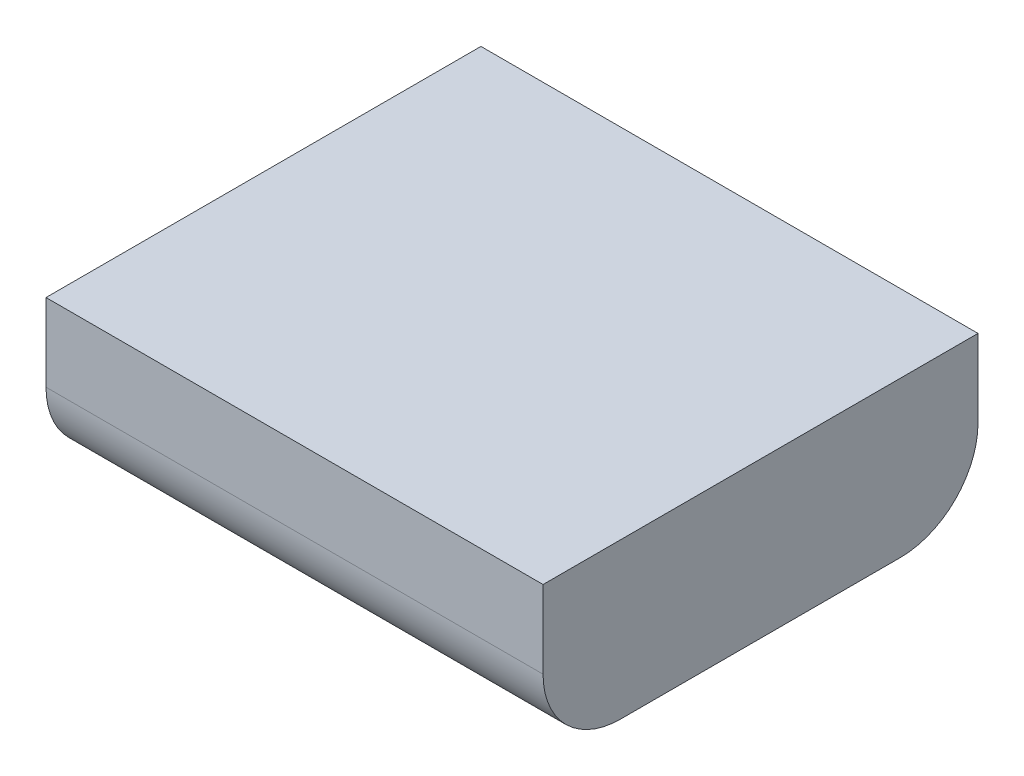
ISO-10303-21;
HEADER;
FILE_DESCRIPTION(('STEP AP214'),'2;1');
FILE_NAME('part.step','',(''),(''),'','','');
FILE_SCHEMA(('AUTOMOTIVE_DESIGN { 1 0 10303 214 1 1 1 1 }'));
ENDSEC;
DATA;
#1=APPLICATION_CONTEXT('core data for automotive mechanical design processes');
#2=APPLICATION_PROTOCOL_DEFINITION('international standard','automotive_design',2000,#1);
#3=PRODUCT_CONTEXT('',#1,'mechanical');
#4=PRODUCT('Part','Part','',(#3));
#5=PRODUCT_RELATED_PRODUCT_CATEGORY('part','',(#4));
#6=PRODUCT_DEFINITION_FORMATION('','',#4);
#7=PRODUCT_DEFINITION_CONTEXT('part definition',#1,'design');
#8=PRODUCT_DEFINITION('design','',#6,#7);
#9=PRODUCT_DEFINITION_SHAPE('','',#8);
#10=(LENGTH_UNIT() NAMED_UNIT(*) SI_UNIT(.MILLI.,.METRE.));
#11=(NAMED_UNIT(*) PLANE_ANGLE_UNIT() SI_UNIT($,.RADIAN.));
#12=(NAMED_UNIT(*) SI_UNIT($,.STERADIAN.) SOLID_ANGLE_UNIT());
#13=UNCERTAINTY_MEASURE_WITH_UNIT(LENGTH_MEASURE(1.E-05),#10,'distance_accuracy_value','');
#14=(GEOMETRIC_REPRESENTATION_CONTEXT(3) GLOBAL_UNCERTAINTY_ASSIGNED_CONTEXT((#13)) GLOBAL_UNIT_ASSIGNED_CONTEXT((#10,
#11,#12)) REPRESENTATION_CONTEXT('',''));
#15=CARTESIAN_POINT('',(0.,0.,0.));
#16=DIRECTION('',(0.,0.,1.));
#17=DIRECTION('',(1.,0.,0.));
#18=AXIS2_PLACEMENT_3D('',#15,#16,#17);
#19=CARTESIAN_POINT('',(16.,-5.,-14.));
#20=DIRECTION('',(0.,0.,1.));
#21=DIRECTION('',(1.,0.,0.));
#22=AXIS2_PLACEMENT_3D('',#19,#20,#21);
#23=PLANE('',#22);
#24=DIRECTION('',(0.,1.,0.));
#25=VECTOR('',#24,1.);
#26=CARTESIAN_POINT('',(16.,-5.,-14.));
#27=LINE('',#26,#25);
#28=CARTESIAN_POINT('',(16.,0.,-14.));
#29=VERTEX_POINT('',#28);
#30=CARTESIAN_POINT('',(16.,5.,-14.));
#31=VERTEX_POINT('',#30);
#32=EDGE_CURVE('E87',#29,#31,#27,.T.);
#33=ORIENTED_EDGE('',*,*,#32,.F.);
#34=DIRECTION('',(-1.,0.,0.));
#35=VECTOR('',#34,1.);
#36=CARTESIAN_POINT('',(16.,0.,-14.));
#37=LINE('',#36,#35);
#38=CARTESIAN_POINT('',(-16.,0.,-14.));
#39=VERTEX_POINT('',#38);
#40=EDGE_CURVE('E110',#29,#39,#37,.T.);
#41=ORIENTED_EDGE('',*,*,#40,.T.);
#42=DIRECTION('',(0.,1.,0.));
#43=VECTOR('',#42,1.);
#44=CARTESIAN_POINT('',(-16.,-5.,-14.));
#45=LINE('',#44,#43);
#46=CARTESIAN_POINT('',(-16.,5.,-14.));
#47=VERTEX_POINT('',#46);
#48=EDGE_CURVE('E108',#39,#47,#45,.T.);
#49=ORIENTED_EDGE('',*,*,#48,.T.);
#50=DIRECTION('',(-1.,0.,0.));
#51=VECTOR('',#50,1.);
#52=CARTESIAN_POINT('',(16.,5.,-14.));
#53=LINE('',#52,#51);
#54=EDGE_CURVE('E102',#31,#47,#53,.T.);
#55=ORIENTED_EDGE('',*,*,#54,.F.);
#56=EDGE_LOOP('',(#33,#41,#49,#55));
#57=FACE_BOUND('',#56,.T.);
#58=ADVANCED_FACE('F33',(#57),#23,.F.);
#59=CARTESIAN_POINT('',(16.,5.,14.));
#60=DIRECTION('',(0.,-1.,0.));
#61=DIRECTION('',(0.,0.,-1.));
#62=AXIS2_PLACEMENT_3D('',#59,#60,#61);
#63=PLANE('',#62);
#64=DIRECTION('',(0.,0.,1.));
#65=VECTOR('',#64,1.);
#66=CARTESIAN_POINT('',(-16.,5.,14.));
#67=LINE('',#66,#65);
#68=CARTESIAN_POINT('',(-16.,5.,14.));
#69=VERTEX_POINT('',#68);
#70=EDGE_CURVE('E137',#47,#69,#67,.T.);
#71=ORIENTED_EDGE('',*,*,#70,.T.);
#72=DIRECTION('',(-1.,0.,0.));
#73=VECTOR('',#72,1.);
#74=CARTESIAN_POINT('',(16.,5.,14.));
#75=LINE('',#74,#73);
#76=CARTESIAN_POINT('',(16.,5.,14.));
#77=VERTEX_POINT('',#76);
#78=EDGE_CURVE('E104',#77,#69,#75,.T.);
#79=ORIENTED_EDGE('',*,*,#78,.F.);
#80=DIRECTION('',(0.,0.,1.));
#81=VECTOR('',#80,1.);
#82=CARTESIAN_POINT('',(16.,5.,14.));
#83=LINE('',#82,#81);
#84=EDGE_CURVE('E90',#31,#77,#83,.T.);
#85=ORIENTED_EDGE('',*,*,#84,.F.);
#86=ORIENTED_EDGE('',*,*,#54,.T.);
#87=EDGE_LOOP('',(#71,#79,#85,#86));
#88=FACE_BOUND('',#87,.T.);
#89=ADVANCED_FACE('F101',(#88),#63,.F.);
#90=CARTESIAN_POINT('',(16.,-5.,14.));
#91=DIRECTION('',(0.,0.,-1.));
#92=DIRECTION('',(-1.,0.,0.));
#93=AXIS2_PLACEMENT_3D('',#90,#91,#92);
#94=PLANE('',#93);
#95=DIRECTION('',(0.,-1.,0.));
#96=VECTOR('',#95,1.);
#97=CARTESIAN_POINT('',(-16.,-5.,14.));
#98=LINE('',#97,#96);
#99=CARTESIAN_POINT('',(-16.,0.,14.));
#100=VERTEX_POINT('',#99);
#101=EDGE_CURVE('E135',#69,#100,#98,.T.);
#102=ORIENTED_EDGE('',*,*,#101,.T.);
#103=DIRECTION('',(-1.,0.,0.));
#104=VECTOR('',#103,1.);
#105=CARTESIAN_POINT('',(16.,0.,14.));
#106=LINE('',#105,#104);
#107=CARTESIAN_POINT('',(16.,0.,14.));
#108=VERTEX_POINT('',#107);
#109=EDGE_CURVE('E11',#100,#108,#106,.F.);
#110=ORIENTED_EDGE('',*,*,#109,.T.);
#111=DIRECTION('',(0.,-1.,0.));
#112=VECTOR('',#111,1.);
#113=CARTESIAN_POINT('',(16.,-5.,14.));
#114=LINE('',#113,#112);
#115=EDGE_CURVE('E105',#77,#108,#114,.T.);
#116=ORIENTED_EDGE('',*,*,#115,.F.);
#117=ORIENTED_EDGE('',*,*,#78,.T.);
#118=EDGE_LOOP('',(#102,#110,#116,#117));
#119=FACE_BOUND('',#118,.T.);
#120=ADVANCED_FACE('F136',(#119),#94,.F.);
#121=CARTESIAN_POINT('',(16.,-5.,14.));
#122=DIRECTION('',(0.,1.,0.));
#123=DIRECTION('',(0.,0.,1.));
#124=AXIS2_PLACEMENT_3D('',#121,#122,#123);
#125=PLANE('',#124);
#126=DIRECTION('',(0.,0.,-1.));
#127=VECTOR('',#126,1.);
#128=CARTESIAN_POINT('',(-16.,-5.,14.));
#129=LINE('',#128,#127);
#130=CARTESIAN_POINT('',(-16.,-5.,9.));
#131=VERTEX_POINT('',#130);
#132=CARTESIAN_POINT('',(-16.,-5.,-9.));
#133=VERTEX_POINT('',#132);
#134=EDGE_CURVE('E97',#131,#133,#129,.T.);
#135=ORIENTED_EDGE('',*,*,#134,.T.);
#136=DIRECTION('',(-1.,0.,0.));
#137=VECTOR('',#136,1.);
#138=CARTESIAN_POINT('',(16.,-5.,-9.));
#139=LINE('',#138,#137);
#140=CARTESIAN_POINT('',(16.,-5.,-9.));
#141=VERTEX_POINT('',#140);
#142=EDGE_CURVE('E54',#133,#141,#139,.F.);
#143=ORIENTED_EDGE('',*,*,#142,.T.);
#144=DIRECTION('',(0.,0.,-1.));
#145=VECTOR('',#144,1.);
#146=CARTESIAN_POINT('',(16.,-5.,14.));
#147=LINE('',#146,#145);
#148=CARTESIAN_POINT('',(16.,-5.,9.));
#149=VERTEX_POINT('',#148);
#150=EDGE_CURVE('E114',#149,#141,#147,.T.);
#151=ORIENTED_EDGE('',*,*,#150,.F.);
#152=DIRECTION('',(-1.,0.,0.));
#153=VECTOR('',#152,1.);
#154=CARTESIAN_POINT('',(16.,-5.,9.));
#155=LINE('',#154,#153);
#156=EDGE_CURVE('E121',#149,#131,#155,.T.);
#157=ORIENTED_EDGE('',*,*,#156,.T.);
#158=EDGE_LOOP('',(#135,#143,#151,#157));
#159=FACE_BOUND('',#158,.T.);
#160=ADVANCED_FACE('F129',(#159),#125,.F.);
#161=CARTESIAN_POINT('',(16.,0.,0.));
#162=DIRECTION('',(-1.,0.,0.));
#163=DIRECTION('',(0.,0.,1.));
#164=AXIS2_PLACEMENT_3D('',#161,#162,#163);
#165=PLANE('',#164);
#166=ORIENTED_EDGE('',*,*,#150,.T.);
#167=CARTESIAN_POINT('',(16.,0.,-9.));
#168=DIRECTION('',(-1.,0.,0.));
#169=DIRECTION('',(0.,0.,1.));
#170=AXIS2_PLACEMENT_3D('',#167,#168,#169);
#171=CIRCLE('',#170,5.);
#172=EDGE_CURVE('E41',#141,#29,#171,.F.);
#173=ORIENTED_EDGE('',*,*,#172,.T.);
#174=ORIENTED_EDGE('',*,*,#32,.T.);
#175=ORIENTED_EDGE('',*,*,#84,.T.);
#176=ORIENTED_EDGE('',*,*,#115,.T.);
#177=CARTESIAN_POINT('',(16.,0.,9.));
#178=DIRECTION('',(-1.,0.,0.));
#179=DIRECTION('',(0.,0.,1.));
#180=AXIS2_PLACEMENT_3D('',#177,#178,#179);
#181=CIRCLE('',#180,5.);
#182=EDGE_CURVE('E125',#108,#149,#181,.F.);
#183=ORIENTED_EDGE('',*,*,#182,.T.);
#184=EDGE_LOOP('',(#166,#173,#174,#175,#176,#183));
#185=FACE_BOUND('',#184,.T.);
#186=ADVANCED_FACE('F89',(#185),#165,.F.);
#187=CARTESIAN_POINT('',(-16.,0.,0.));
#188=DIRECTION('',(-1.,0.,0.));
#189=DIRECTION('',(0.,0.,1.));
#190=AXIS2_PLACEMENT_3D('',#187,#188,#189);
#191=PLANE('',#190);
#192=ORIENTED_EDGE('',*,*,#48,.F.);
#193=CARTESIAN_POINT('',(-16.,0.,-9.));
#194=DIRECTION('',(-1.,0.,0.));
#195=DIRECTION('',(0.,0.,1.));
#196=AXIS2_PLACEMENT_3D('',#193,#194,#195);
#197=CIRCLE('',#196,5.);
#198=EDGE_CURVE('E119',#39,#133,#197,.T.);
#199=ORIENTED_EDGE('',*,*,#198,.T.);
#200=ORIENTED_EDGE('',*,*,#134,.F.);
#201=CARTESIAN_POINT('',(-16.,0.,9.));
#202=DIRECTION('',(-1.,0.,0.));
#203=DIRECTION('',(0.,0.,1.));
#204=AXIS2_PLACEMENT_3D('',#201,#202,#203);
#205=CIRCLE('',#204,5.);
#206=EDGE_CURVE('E112',#131,#100,#205,.T.);
#207=ORIENTED_EDGE('',*,*,#206,.T.);
#208=ORIENTED_EDGE('',*,*,#101,.F.);
#209=ORIENTED_EDGE('',*,*,#70,.F.);
#210=EDGE_LOOP('',(#192,#199,#200,#207,#208,#209));
#211=FACE_BOUND('',#210,.T.);
#212=ADVANCED_FACE('F134',(#211),#191,.T.);
#213=CARTESIAN_POINT('',(16.,0.,-9.));
#214=DIRECTION('',(-1.,0.,0.));
#215=DIRECTION('',(0.,0.,1.));
#216=AXIS2_PLACEMENT_3D('',#213,#214,#215);
#217=CYLINDRICAL_SURFACE('',#216,5.);
#218=ORIENTED_EDGE('',*,*,#172,.F.);
#219=ORIENTED_EDGE('',*,*,#142,.F.);
#220=ORIENTED_EDGE('',*,*,#198,.F.);
#221=ORIENTED_EDGE('',*,*,#40,.F.);
#222=EDGE_LOOP('',(#218,#219,#220,#221));
#223=FACE_BOUND('',#222,.T.);
#224=ADVANCED_FACE('F143',(#223),#217,.T.);
#225=CARTESIAN_POINT('',(16.,0.,9.));
#226=DIRECTION('',(-1.,0.,0.));
#227=DIRECTION('',(0.,0.,1.));
#228=AXIS2_PLACEMENT_3D('',#225,#226,#227);
#229=CYLINDRICAL_SURFACE('',#228,5.);
#230=ORIENTED_EDGE('',*,*,#182,.F.);
#231=ORIENTED_EDGE('',*,*,#109,.F.);
#232=ORIENTED_EDGE('',*,*,#206,.F.);
#233=ORIENTED_EDGE('',*,*,#156,.F.);
#234=EDGE_LOOP('',(#230,#231,#232,#233));
#235=FACE_BOUND('',#234,.T.);
#236=ADVANCED_FACE('F35',(#235),#229,.T.);
#237=CLOSED_SHELL('',(#58,#89,#120,#160,#186,#212,#224,#236));
#238=MANIFOLD_SOLID_BREP('B2',#237);
#239=ADVANCED_BREP_SHAPE_REPRESENTATION('',(#18,#238),#14);
#240=SHAPE_DEFINITION_REPRESENTATION(#9,#239);
ENDSEC;
END-ISO-10303-21;
